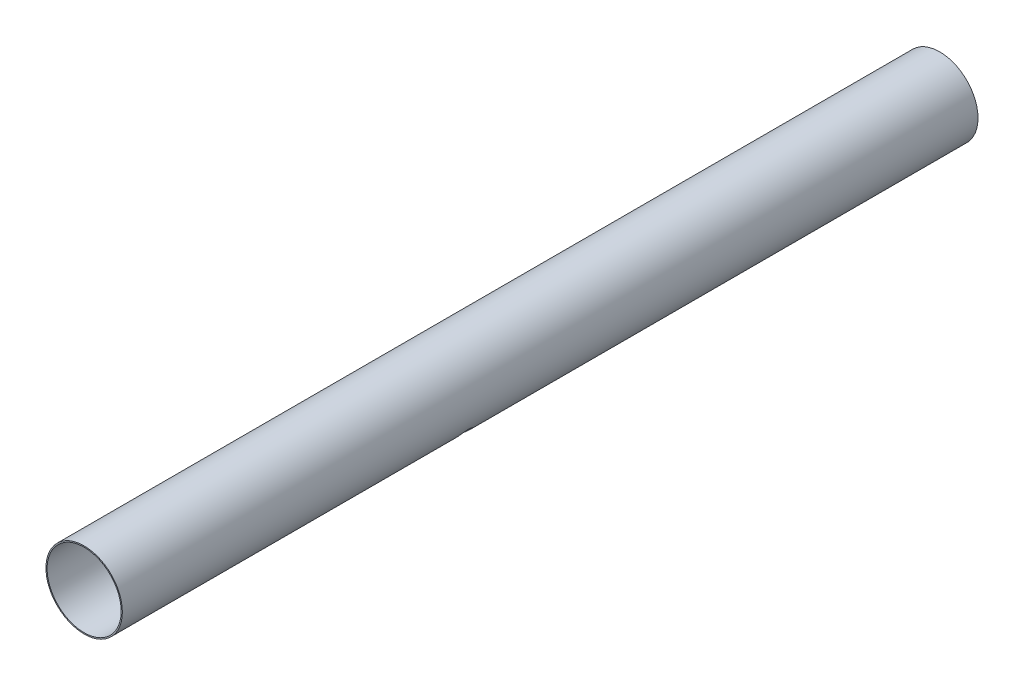
ISO-10303-21;
HEADER;
FILE_DESCRIPTION(('STEP AP214'),'2;1');
FILE_NAME('part.step','',(''),(''),'','','');
FILE_SCHEMA(('AUTOMOTIVE_DESIGN { 1 0 10303 214 1 1 1 1 }'));
ENDSEC;
DATA;
#1=APPLICATION_CONTEXT('core data for automotive mechanical design processes');
#2=APPLICATION_PROTOCOL_DEFINITION('international standard','automotive_design',2000,#1);
#3=PRODUCT_CONTEXT('',#1,'mechanical');
#4=PRODUCT('Part','Part','',(#3));
#5=PRODUCT_RELATED_PRODUCT_CATEGORY('part','',(#4));
#6=PRODUCT_DEFINITION_FORMATION('','',#4);
#7=PRODUCT_DEFINITION_CONTEXT('part definition',#1,'design');
#8=PRODUCT_DEFINITION('design','',#6,#7);
#9=PRODUCT_DEFINITION_SHAPE('','',#8);
#10=(LENGTH_UNIT() NAMED_UNIT(*) SI_UNIT(.MILLI.,.METRE.));
#11=(NAMED_UNIT(*) PLANE_ANGLE_UNIT() SI_UNIT($,.RADIAN.));
#12=(NAMED_UNIT(*) SI_UNIT($,.STERADIAN.) SOLID_ANGLE_UNIT());
#13=UNCERTAINTY_MEASURE_WITH_UNIT(LENGTH_MEASURE(1.E-05),#10,'distance_accuracy_value','');
#14=(GEOMETRIC_REPRESENTATION_CONTEXT(3) GLOBAL_UNCERTAINTY_ASSIGNED_CONTEXT((#13)) GLOBAL_UNIT_ASSIGNED_CONTEXT((#10,
#11,#12)) REPRESENTATION_CONTEXT('',''));
#15=CARTESIAN_POINT('',(0.,0.,0.));
#16=DIRECTION('',(0.,0.,1.));
#17=DIRECTION('',(1.,0.,0.));
#18=AXIS2_PLACEMENT_3D('',#15,#16,#17);
#19=CARTESIAN_POINT('',(0.,0.,1760.));
#20=DIRECTION('',(0.,0.,-1.));
#21=DIRECTION('',(-1.,0.,0.));
#22=AXIS2_PLACEMENT_3D('',#19,#20,#21);
#23=CYLINDRICAL_SURFACE('',#22,78.6);
#24=CARTESIAN_POINT('',(0.,0.,1760.));
#25=DIRECTION('',(0.,0.,1.));
#26=DIRECTION('',(1.,0.,0.));
#27=AXIS2_PLACEMENT_3D('',#24,#25,#26);
#28=CIRCLE('',#27,78.6);
#29=CARTESIAN_POINT('',(78.6,0.,1760.));
#30=VERTEX_POINT('',#29);
#31=EDGE_CURVE('E10',#30,#30,#28,.T.);
#32=ORIENTED_EDGE('',*,*,#31,.F.);
#33=EDGE_LOOP('',(#32));
#34=FACE_BOUND('',#33,.T.);
#35=CARTESIAN_POINT('',(0.,0.,0.));
#36=DIRECTION('',(0.,0.,1.));
#37=DIRECTION('',(1.,0.,0.));
#38=AXIS2_PLACEMENT_3D('',#35,#36,#37);
#39=CIRCLE('',#38,78.6);
#40=CARTESIAN_POINT('',(78.6,0.,0.));
#41=VERTEX_POINT('',#40);
#42=EDGE_CURVE('E45',#41,#41,#39,.T.);
#43=ORIENTED_EDGE('',*,*,#42,.T.);
#44=EDGE_LOOP('',(#43));
#45=FACE_BOUND('',#44,.T.);
#46=CARTESIAN_POINT('',(43.9505243062146,-65.1637277418107,1034.89));
#47=CARTESIAN_POINT('',(43.9505159620552,-65.1637303721092,1034.47271713877));
#48=CARTESIAN_POINT('',(43.9652384217338,-65.1538100614205,1034.0555334168));
#49=CARTESIAN_POINT('',(44.023943721418,-65.1141592396774,1033.22405097841));
#50=CARTESIAN_POINT('',(44.0679317584668,-65.0844252100595,1032.80975278762));
#51=CARTESIAN_POINT('',(44.1847242353224,-65.0051927845604,1031.98684421546));
#52=CARTESIAN_POINT('',(44.2575505430732,-64.9556793898151,1031.57823839457));
#53=CARTESIAN_POINT('',(44.4311914773969,-64.8370285672558,1030.76993867007));
#54=CARTESIAN_POINT('',(44.5320049126211,-64.767891974754,1030.37024438789));
#55=CARTESIAN_POINT('',(44.7604031320895,-64.6102586753202,1029.58292397466));
#56=CARTESIAN_POINT('',(44.8879624595007,-64.521780374507,1029.19528676766));
#57=CARTESIAN_POINT('',(45.1685479784072,-64.3256679034896,1028.43433995646));
#58=CARTESIAN_POINT('',(45.3215744167648,-64.2180335475979,1028.06103049119));
#59=CARTESIAN_POINT('',(45.6514944374181,-63.9839194147253,1027.33129791009));
#60=CARTESIAN_POINT('',(45.8283857520416,-63.8574414281721,1026.97487319419));
#61=CARTESIAN_POINT('',(46.2042780638948,-63.5859922627958,1026.28124444031));
#62=CARTESIAN_POINT('',(46.4032792192955,-63.4410209516726,1025.94404053985));
#63=CARTESIAN_POINT('',(46.8238861055079,-63.1312337250926,1025.28730638127));
#64=CARTESIAN_POINT('',(47.0457265130466,-62.9662078147052,1024.96802543716));
#65=CARTESIAN_POINT('',(47.5079383403382,-62.6182038883205,1024.35356858933));
#66=CARTESIAN_POINT('',(47.7483099044749,-62.4352257324468,1024.05839287346));
#67=CARTESIAN_POINT('',(48.2453637225954,-62.0519407704507,1023.49413691808));
#68=CARTESIAN_POINT('',(48.5020470395295,-61.8516328347305,1023.22505838208));
#69=CARTESIAN_POINT('',(49.0293826987146,-61.4344580807282,1022.71487631131));
#70=CARTESIAN_POINT('',(49.3000350719923,-61.2175912256665,1022.47377283867));
#71=CARTESIAN_POINT('',(49.8551026647136,-60.7664186606928,1022.01944584749));
#72=CARTESIAN_POINT('',(50.1396099715229,-60.531988345698,1021.80645847145));
#73=CARTESIAN_POINT('',(50.7178663007605,-60.0483146891936,1021.41219645256));
#74=CARTESIAN_POINT('',(51.0116153872086,-59.7990712450597,1021.23092202944));
#75=CARTESIAN_POINT('',(51.6057853992038,-59.2870700813203,1020.901468806));
#76=CARTESIAN_POINT('',(51.9062058837896,-59.0243132534112,1020.7532878254));
#77=CARTESIAN_POINT('',(52.5111755444465,-58.486751994383,1020.49116027846));
#78=CARTESIAN_POINT('',(52.815724665699,-58.2119477231181,1020.37721325804));
#79=CARTESIAN_POINT('',(53.4227376038693,-57.65534343149,1020.18561964427));
#80=CARTESIAN_POINT('',(53.7251824502031,-57.3736672936267,1020.10755296146));
#81=CARTESIAN_POINT('',(54.3292223952149,-56.8020113489932,1019.98633911665));
#82=CARTESIAN_POINT('',(54.6308175000117,-56.5120316021843,1019.94319170257));
#83=CARTESIAN_POINT('',(55.2308150282704,-55.9257809798318,1019.8921652345));
#84=CARTESIAN_POINT('',(55.5292176967182,-55.6295105923124,1019.88428345461));
#85=CARTESIAN_POINT('',(56.120647708474,-55.0328025725701,1019.90384480843));
#86=CARTESIAN_POINT('',(56.4136750897873,-54.7323649698372,1019.93128769229));
#87=CARTESIAN_POINT('',(56.9885307500805,-54.1335146235594,1020.02069021901));
#88=CARTESIAN_POINT('',(57.2704550709959,-53.8351262908086,1020.08219674972));
#89=CARTESIAN_POINT('',(57.8252357664962,-53.2387825322118,1020.23892501881));
#90=CARTESIAN_POINT('',(58.0980922326312,-52.9408271020241,1020.33414641669));
#91=CARTESIAN_POINT('',(58.6330985460348,-52.3476770163058,1020.55757808964));
#92=CARTESIAN_POINT('',(58.8952481296284,-52.0524824289034,1020.68578917658));
#93=CARTESIAN_POINT('',(59.4073718111308,-51.4672263958081,1020.97423981583));
#94=CARTESIAN_POINT('',(59.6573458004926,-51.177164995893,1021.1344796536));
#95=CARTESIAN_POINT('',(60.1452481196693,-50.6028845960812,1021.4868393449));
#96=CARTESIAN_POINT('',(60.3830981107435,-50.3187092796868,1021.67913884218));
#97=CARTESIAN_POINT('',(60.8440579056799,-49.7603426950927,1022.09357664517));
#98=CARTESIAN_POINT('',(61.0671676757844,-49.4861514497589,1022.31571501922));
#99=CARTESIAN_POINT('',(61.4977077866526,-48.9500781766212,1022.78830019676));
#100=CARTESIAN_POINT('',(61.7051367386704,-48.6881972398346,1023.03874950267));
#101=CARTESIAN_POINT('',(62.1034844071734,-48.1790589924253,1023.56623316623));
#102=CARTESIAN_POINT('',(62.2944029404067,-47.9318018441242,1023.84326781889));
#103=CARTESIAN_POINT('',(62.6619479362179,-47.450326455986,1024.4266712114));
#104=CARTESIAN_POINT('',(62.8382989447747,-47.2163779863757,1024.73343626965));
#105=CARTESIAN_POINT('',(63.1726593203938,-46.7680802878327,1025.37039415483));
#106=CARTESIAN_POINT('',(63.3306684834208,-46.5537312769304,1025.70058724232));
#107=CARTESIAN_POINT('',(63.6278472616623,-46.1467287015571,1026.38215852019));
#108=CARTESIAN_POINT('',(63.7670164774598,-45.9540755970654,1026.73353715949));
#109=CARTESIAN_POINT('',(64.0260927400344,-45.5924220777656,1027.45506855271));
#110=CARTESIAN_POINT('',(64.1459998582128,-45.4234215752819,1027.82522123703));
#111=CARTESIAN_POINT('',(64.3664063776047,-45.110557922407,1028.58243596779));
#112=CARTESIAN_POINT('',(64.4668699059638,-44.9667412811652,1028.96952768363));
#113=CARTESIAN_POINT('',(64.6478291357391,-44.7061893689188,1029.75726223645));
#114=CARTESIAN_POINT('',(64.7283247768564,-44.5894541796949,1030.15790511436));
#115=CARTESIAN_POINT('',(64.8691123361014,-44.3843863227232,1030.9698293318));
#116=CARTESIAN_POINT('',(64.9294062019212,-44.296050916931,1031.38110964165));
#117=CARTESIAN_POINT('',(65.0296284272761,-44.1487867970569,1032.21134421769));
#118=CARTESIAN_POINT('',(65.0695570830811,-44.0898576551778,1032.63029837216));
#119=CARTESIAN_POINT('',(65.1284719283267,-44.0027824586977,1033.46620374427));
#120=CARTESIAN_POINT('',(65.1477753559115,-43.9741701575764,1033.88308410895));
#121=CARTESIAN_POINT('',(65.1664846829048,-43.9464396591296,1034.71826818169));
#122=CARTESIAN_POINT('',(65.1658907882281,-43.9473211565768,1035.13657187496));
#123=CARTESIAN_POINT('',(65.1448079505444,-43.9785669209015,1035.9715518404));
#124=CARTESIAN_POINT('',(65.1243199679931,-44.0089297644654,1036.38822819016));
#125=CARTESIAN_POINT('',(65.0635074898809,-44.0987860259559,1037.21696474973));
#126=CARTESIAN_POINT('',(65.0231830309994,-44.1582793900177,1037.62902496807));
#127=CARTESIAN_POINT('',(64.9232431717476,-44.3050820542461,1038.44205458946));
#128=CARTESIAN_POINT('',(64.8637971626902,-44.3921470058527,1038.84308899881));
#129=CARTESIAN_POINT('',(64.7256815512105,-44.5932844234763,1039.63493790712));
#130=CARTESIAN_POINT('',(64.6470120932625,-44.7073566865189,1040.02575248286));
#131=CARTESIAN_POINT('',(64.4706570232871,-44.9612973789185,1040.79451951331));
#132=CARTESIAN_POINT('',(64.3729703068437,-45.1011673064346,1041.17247121951));
#133=CARTESIAN_POINT('',(64.1588486004493,-45.4052497499538,1041.91295650901));
#134=CARTESIAN_POINT('',(64.0424133804261,-45.5694625646783,1042.27548990303));
#135=CARTESIAN_POINT('',(63.7896163930167,-45.9226801042207,1042.98696232006));
#136=CARTESIAN_POINT('',(63.6530334256289,-46.1119572832868,1043.33568750251));
#137=CARTESIAN_POINT('',(63.3613989583273,-46.5118731610607,1044.01255797379));
#138=CARTESIAN_POINT('',(63.2063473333992,-46.7225120043642,1044.34070312328));
#139=CARTESIAN_POINT('',(62.8782402274934,-47.163146005187,1044.9742519029));
#140=CARTESIAN_POINT('',(62.7051832735549,-47.3931427460221,1045.27965366895));
#141=CARTESIAN_POINT('',(62.3416466793096,-47.8703356638075,1045.86564495831));
#142=CARTESIAN_POINT('',(62.1511669062523,-48.1175319718039,1046.14623429254));
#143=CARTESIAN_POINT('',(61.7506994087782,-48.6304268854172,1046.68442054399));
#144=CARTESIAN_POINT('',(61.5404773356028,-48.89633490467,1046.94164367382));
#145=CARTESIAN_POINT('',(61.1036683548078,-49.4411123261279,1047.42681306907));
#146=CARTESIAN_POINT('',(60.8770812752116,-49.719981864532,1047.65475902675));
#147=CARTESIAN_POINT('',(60.4085556439882,-50.2881891881918,1048.07971502209));
#148=CARTESIAN_POINT('',(60.1666174925243,-50.5775267004897,1048.27672586569));
#149=CARTESIAN_POINT('',(59.668570726746,-51.1641445284282,1048.63834961716));
#150=CARTESIAN_POINT('',(59.4124622445195,-51.4614247700178,1048.80296282697));
#151=CARTESIAN_POINT('',(58.8888662996428,-52.0597598709045,1049.09773556996));
#152=CARTESIAN_POINT('',(58.6214475468365,-52.3607857796624,1049.22807587968));
#153=CARTESIAN_POINT('',(58.075507290055,-52.9656626167252,1049.45444635702));
#154=CARTESIAN_POINT('',(57.796985808535,-53.2695135393155,1049.55047659403));
#155=CARTESIAN_POINT('',(57.2306180468551,-53.8775365897032,1049.70745475275));
#156=CARTESIAN_POINT('',(56.9427726216584,-54.18170868559,1049.76840588149));
#157=CARTESIAN_POINT('',(56.3596742904729,-54.7879913402614,1049.85474496104));
#158=CARTESIAN_POINT('',(56.0644214738202,-55.0901019238528,1049.88013334055));
#159=CARTESIAN_POINT('',(55.4733499941233,-55.6851912625596,1049.89502223923));
#160=CARTESIAN_POINT('',(55.1776146642486,-55.9782388515381,1049.8850858753));
#161=CARTESIAN_POINT('',(54.5831642620783,-56.5580282337268,1049.83065084087));
#162=CARTESIAN_POINT('',(54.2844492235289,-56.8447700982332,1049.78615256136));
#163=CARTESIAN_POINT('',(53.686299344519,-57.41002172112,1049.66294584436));
#164=CARTESIAN_POINT('',(53.3868645150071,-57.6885316038682,1049.58423792398));
#165=CARTESIAN_POINT('',(52.789602409827,-58.2355723234857,1049.39322406219));
#166=CARTESIAN_POINT('',(52.4917751400124,-58.5041031240396,1049.28091799852));
#167=CARTESIAN_POINT('',(51.9006744607119,-59.0291111894653,1049.02381078195));
#168=CARTESIAN_POINT('',(51.6073934352617,-59.2856105117969,1048.87907214866));
#169=CARTESIAN_POINT('',(51.0271862110578,-59.7857255049948,1048.55805206932));
#170=CARTESIAN_POINT('',(50.7402599933206,-60.0293412143509,1048.38177071751));
#171=CARTESIAN_POINT('',(50.1751186770055,-60.5025066435512,1047.99892604607));
#172=CARTESIAN_POINT('',(49.8969040288809,-60.7320556366262,1047.79236116367));
#173=CARTESIAN_POINT('',(49.3515401933253,-61.1760504083489,1047.35040412403));
#174=CARTESIAN_POINT('',(49.0843911374282,-61.3904960074873,1047.11501162424));
#175=CARTESIAN_POINT('',(48.5595940368193,-61.8064689875629,1046.61332127152));
#176=CARTESIAN_POINT('',(48.3021450790836,-62.0077582557537,1046.34661764068));
#177=CARTESIAN_POINT('',(47.8033265199174,-62.3931192682231,1045.78701745007));
#178=CARTESIAN_POINT('',(47.5619571147434,-62.5771908023642,1045.4941205707));
#179=CARTESIAN_POINT('',(47.0974797123052,-62.9275143668693,1044.88405193217));
#180=CARTESIAN_POINT('',(46.8743760265516,-63.0937621929067,1044.56687447573));
#181=CARTESIAN_POINT('',(46.4486238819879,-63.4078492121361,1043.91044804869));
#182=CARTESIAN_POINT('',(46.2459752605466,-63.5556885516898,1043.5711992536));
#183=CARTESIAN_POINT('',(45.8612726598169,-63.8338513888835,1042.86953155945));
#184=CARTESIAN_POINT('',(45.6794369285081,-63.9639915607438,1042.50692022777));
#185=CARTESIAN_POINT('',(45.3405416372599,-64.2046610104861,1041.76404281193));
#186=CARTESIAN_POINT('',(45.183482024728,-64.3151903299964,1041.38377676526));
#187=CARTESIAN_POINT('',(44.8959439520747,-64.5162383496425,1040.60855894281));
#188=CARTESIAN_POINT('',(44.7654437719233,-64.6067734060809,1040.21361948194));
#189=CARTESIAN_POINT('',(44.5323397371107,-64.767667116056,1039.41172364547));
#190=CARTESIAN_POINT('',(44.4297303082459,-64.8380298013663,1039.00476968913));
#191=CARTESIAN_POINT('',(44.2124060645775,-64.9865228025152,1037.98934139227));
#192=CARTESIAN_POINT('',(44.1143934288964,-65.0529509111443,1037.37546104263));
#193=CARTESIAN_POINT('',(43.9834597297827,-65.1415507731625,1036.13764643733));
#194=CARTESIAN_POINT('',(43.9505367782253,-65.163723810305,1035.51371247383));
#195=CARTESIAN_POINT('',(43.9505243062146,-65.1637277418107,1034.89));
#196=B_SPLINE_CURVE_WITH_KNOTS('',3,(#46,#47,#48,#49,#50,#51,#52,#53,#54,#55,#56,#57,#58,#59,
#60,#61,#62,#63,#64,#65,#66,#67,#68,#69,#70,#71,#72,#73,#74,#75,#76,#77,#78,#79,#80,#81,#82,#83,
#84,#85,#86,#87,#88,#89,#90,#91,#92,#93,#94,#95,#96,#97,#98,#99,#100,#101,#102,#103,#104,#105,
#106,#107,#108,#109,#110,#111,#112,#113,#114,#115,#116,#117,#118,#119,#120,#121,#122,#123,#124,
#125,#126,#127,#128,#129,#130,#131,#132,#133,#134,#135,#136,#137,#138,#139,#140,#141,#142,#143,
#144,#145,#146,#147,#148,#149,#150,#151,#152,#153,#154,#155,#156,#157,#158,#159,#160,#161,#162,
#163,#164,#165,#166,#167,#168,#169,#170,#171,#172,#173,#174,#175,#176,#177,#178,#179,#180,#181,
#182,#183,#184,#185,#186,#187,#188,#189,#190,#191,#192,#193,#194,#195),.UNSPECIFIED.,.T.,.F.,(4,
2,2,2,2,2,2,2,2,2,2,2,2,2,2,2,2,2,2,2,2,2,2,2,2,2,2,2,2,2,2,2,2,2,2,2,2,2,2,2,2,2,2,2,2,2,2,2,2,
2,2,2,2,2,2,2,2,2,2,2,2,2,2,2,2,2,2,2,2,2,2,2,2,2,4),(0.,1.25130069540162,2.50282365876023,
3.75529746985888,5.00771797415161,6.25895178799826,7.51019773122328,8.76132486302246,
10.0124609458092,11.2780574568276,12.5436638296248,13.8093527600115,15.0750445017504,
16.3507688950419,17.6265021274886,18.9021512869258,20.1777835252426,21.4380742468262,
22.6983558700173,23.9585400759614,25.2187153685307,26.4625170946593,27.7063062594074,
28.9501260361102,30.1939568995973,31.4450073738822,32.6960607131958,33.9472247205163,
35.1984026129414,36.4694707919436,37.7405531089857,39.0116623694402,40.2827669180139,
41.5561947170215,42.8296263614814,44.1029351965979,45.3762255072913,46.6296361525276,
47.8830338263854,49.1363709911549,50.3897058384068,51.6322302223008,52.8747452682591,
54.1173324940688,55.3599349694361,56.6173651649503,57.8748038724964,59.1323455282538,
60.3898967664538,61.6649271556453,62.9399709458267,64.214981512504,65.4899801962423,
66.7581123498416,68.0262419387697,69.2942555733156,70.5622539224432,71.8101301933192,
73.0579923476787,74.3058356398196,75.5536834725881,76.799146237407,78.0446052812051,
79.2901286185749,80.535666756931,81.7996356887358,83.0636200448921,84.327901901696,
85.5921737058333,86.8686786683946,88.1451809212684,89.4206350315357,90.6958340437248,
92.5662067935237,94.4365252866626),.UNSPECIFIED.);
#197=CARTESIAN_POINT('',(43.9505243062146,-65.1637277418107,1034.89));
#198=VERTEX_POINT('',#197);
#199=EDGE_CURVE('E55',#198,#198,#196,.T.);
#200=ORIENTED_EDGE('',*,*,#199,.F.);
#201=EDGE_LOOP('',(#200));
#202=FACE_BOUND('',#201,.T.);
#203=ADVANCED_FACE('F32',(#34,#45,#202),#23,.T.);
#204=CARTESIAN_POINT('',(0.,0.,1760.));
#205=DIRECTION('',(0.,0.,-1.));
#206=DIRECTION('',(-1.,0.,0.));
#207=AXIS2_PLACEMENT_3D('',#204,#205,#206);
#208=CYLINDRICAL_SURFACE('',#207,76.2);
#209=CARTESIAN_POINT('',(0.,0.,0.));
#210=DIRECTION('',(0.,0.,1.));
#211=DIRECTION('',(1.,0.,0.));
#212=AXIS2_PLACEMENT_3D('',#209,#210,#211);
#213=CIRCLE('',#212,76.2);
#214=CARTESIAN_POINT('',(76.2,0.,0.));
#215=VERTEX_POINT('',#214);
#216=EDGE_CURVE('E52',#215,#215,#213,.T.);
#217=ORIENTED_EDGE('',*,*,#216,.F.);
#218=EDGE_LOOP('',(#217));
#219=FACE_BOUND('',#218,.T.);
#220=CARTESIAN_POINT('',(0.,0.,1760.));
#221=DIRECTION('',(0.,0.,1.));
#222=DIRECTION('',(1.,0.,0.));
#223=AXIS2_PLACEMENT_3D('',#220,#221,#222);
#224=CIRCLE('',#223,76.2);
#225=CARTESIAN_POINT('',(76.2,0.,1760.));
#226=VERTEX_POINT('',#225);
#227=EDGE_CURVE('E50',#226,#226,#224,.T.);
#228=ORIENTED_EDGE('',*,*,#227,.T.);
#229=EDGE_LOOP('',(#228));
#230=FACE_BOUND('',#229,.T.);
#231=CARTESIAN_POINT('',(42.2206639695343,-63.4338674051304,1034.89));
#232=CARTESIAN_POINT('',(42.220655133744,-63.4338700710789,1034.47298396823));
#233=CARTESIAN_POINT('',(42.2354375400337,-63.4240409151695,1034.0560702946));
#234=CARTESIAN_POINT('',(42.2943782569194,-63.384753107115,1033.22512997744));
#235=CARTESIAN_POINT('',(42.338541621746,-63.3552910776426,1032.81110384302));
#236=CARTESIAN_POINT('',(42.4557907908649,-63.2767790730241,1031.98875051305));
#237=CARTESIAN_POINT('',(42.5288979119229,-63.2277146606898,1031.58042774795));
#238=CARTESIAN_POINT('',(42.7031928756535,-63.1101288383243,1030.77269221975));
#239=CARTESIAN_POINT('',(42.8043795665676,-63.0416082263384,1030.37327909192));
#240=CARTESIAN_POINT('',(43.0335955842406,-62.8853627610896,1029.58652709342));
#241=CARTESIAN_POINT('',(43.161598523514,-62.7976567827217,1029.19917678004));
#242=CARTESIAN_POINT('',(43.4431258837929,-62.603227226676,1028.43878879139));
#243=CARTESIAN_POINT('',(43.5966505421765,-62.4965034721126,1028.06575124929));
#244=CARTESIAN_POINT('',(43.9276039820411,-62.2643272003438,1027.33653341136));
#245=CARTESIAN_POINT('',(44.1050307235584,-62.1388762813411,1026.98035168044));
#246=CARTESIAN_POINT('',(44.4820112709666,-61.8695750059058,1026.28717176822));
#247=CARTESIAN_POINT('',(44.6815652502133,-61.7257245053201,1025.95017373724));
#248=CARTESIAN_POINT('',(45.1034392235677,-61.418146561159,1025.29356353835));
#249=CARTESIAN_POINT('',(45.3260089697463,-61.2541964669641,1024.97421608683));
#250=CARTESIAN_POINT('',(45.7896893928306,-60.9083571732621,1024.35960117202));
#251=CARTESIAN_POINT('',(46.0308002220734,-60.7264678263591,1024.06433390662));
#252=CARTESIAN_POINT('',(46.5293240793679,-60.3453430530656,1023.49986396426));
#253=CARTESIAN_POINT('',(46.7867382028561,-60.1461064607568,1023.23066304182));
#254=CARTESIAN_POINT('',(47.3155088792477,-59.7310268637411,1022.72020311753));
#255=CARTESIAN_POINT('',(47.5868654656309,-59.515183819157,1022.47894418279));
#256=CARTESIAN_POINT('',(48.1434504242458,-59.0658712791505,1022.02415190559));
#257=CARTESIAN_POINT('',(48.4287766897531,-58.8322681733289,1021.81087024977));
#258=CARTESIAN_POINT('',(49.0086189776314,-58.3501277979006,1021.41602293576));
#259=CARTESIAN_POINT('',(49.3031350678643,-58.1015904179997,1021.23445751184));
#260=CARTESIAN_POINT('',(49.8987655397072,-57.5908592751978,1020.90443369292));
#261=CARTESIAN_POINT('',(50.1998794571661,-57.3286664711677,1020.7559729772));
#262=CARTESIAN_POINT('',(50.8061437333288,-56.7920734460023,1020.49330493958));
#263=CARTESIAN_POINT('',(51.1112940349011,-56.5176733975196,1020.3790971334));
#264=CARTESIAN_POINT('',(51.7191627177076,-55.9619122709981,1020.18708447499));
#265=CARTESIAN_POINT('',(52.0218623675056,-55.6806848984607,1020.1088332232));
#266=CARTESIAN_POINT('',(52.626290223047,-55.1097666728942,1019.98723035295));
#267=CARTESIAN_POINT('',(52.9280184362252,-54.8200758848102,1019.94387846677));
#268=CARTESIAN_POINT('',(53.5281503234551,-54.2342414667681,1019.8924275068));
#269=CARTESIAN_POINT('',(53.8265542679813,-53.9380983676746,1019.88432554375));
#270=CARTESIAN_POINT('',(54.4178510094423,-53.3414836884508,1019.90343282485));
#271=CARTESIAN_POINT('',(54.7107438479163,-53.0410121409757,1019.93064180274));
#272=CARTESIAN_POINT('',(55.2849568272785,-52.442189677018,1020.01952898987));
#273=CARTESIAN_POINT('',(55.5663809638181,-52.1438668434683,1020.0807256247));
#274=CARTESIAN_POINT('',(56.1200485331912,-51.5475092020332,1020.23676327809));
#275=CARTESIAN_POINT('',(56.3922920646458,-51.2494743910872,1020.33160393511));
#276=CARTESIAN_POINT('',(56.9259728006462,-50.6560252053536,1020.55420297249));
#277=CARTESIAN_POINT('',(57.1874097282647,-50.3606108978705,1020.6819621958));
#278=CARTESIAN_POINT('',(57.698025301564,-49.774781536612,1020.96943809291));
#279=CARTESIAN_POINT('',(57.9472038317375,-49.4843665299602,1021.12915506776));
#280=CARTESIAN_POINT('',(58.4335256665877,-48.909158698675,1021.48045208108));
#281=CARTESIAN_POINT('',(58.6705859480002,-48.6244111803175,1021.6722212085));
#282=CARTESIAN_POINT('',(59.1299186937929,-48.0647873174453,1022.08555028497));
#283=CARTESIAN_POINT('',(59.3521911227263,-47.7899109965929,1022.30711030543));
#284=CARTESIAN_POINT('',(59.7810362908824,-47.2523644716936,1022.77849727066));
#285=CARTESIAN_POINT('',(59.987607555197,-46.9896954152494,1023.02832686549));
#286=CARTESIAN_POINT('',(60.3842462316849,-46.4788919064326,1023.55453695886));
#287=CARTESIAN_POINT('',(60.5743134492207,-46.2307576254845,1023.83091777045));
#288=CARTESIAN_POINT('',(60.9403603471968,-45.747196682399,1024.41327135698));
#289=CARTESIAN_POINT('',(61.1160475384402,-45.5120557769189,1024.7196654221));
#290=CARTESIAN_POINT('',(61.4491081841066,-45.0613542434082,1025.35591620378));
#291=CARTESIAN_POINT('',(61.6064814221369,-44.8457938467423,1025.68577319751));
#292=CARTESIAN_POINT('',(61.9024426927744,-44.4363749462168,1026.3667168232));
#293=CARTESIAN_POINT('',(62.0410302839621,-44.2425169523325,1026.71780395376));
#294=CARTESIAN_POINT('',(62.2990212098391,-43.8784884579615,1027.43880491626));
#295=CARTESIAN_POINT('',(62.4184246184148,-43.7083178662451,1027.80871867569));
#296=CARTESIAN_POINT('',(62.6379455119637,-43.3931418807856,1028.5655963502));
#297=CARTESIAN_POINT('',(62.7380231161858,-43.2481885852704,1028.95259354004));
#298=CARTESIAN_POINT('',(62.9183193202124,-42.9854684490392,1029.74020943619));
#299=CARTESIAN_POINT('',(62.9985378549473,-42.8677016974021,1030.14082818714));
#300=CARTESIAN_POINT('',(63.1388936348137,-42.6607051459524,1030.95277102565));
#301=CARTESIAN_POINT('',(63.1990329506538,-42.5714724035545,1031.36409400459));
#302=CARTESIAN_POINT('',(63.2990794791076,-42.4225718096384,1032.19447844721));
#303=CARTESIAN_POINT('',(63.3389870064631,-42.3629034981924,1032.61353979039));
#304=CARTESIAN_POINT('',(63.3979696309242,-42.2745812417168,1033.44929967184));
#305=CARTESIAN_POINT('',(63.4173794444623,-42.2454290566654,1033.86592201827));
#306=CARTESIAN_POINT('',(63.4364793662329,-42.2167429781693,1034.70063406099));
#307=CARTESIAN_POINT('',(63.4361696913857,-42.2172087589182,1035.11872374107));
#308=CARTESIAN_POINT('',(63.4158323048546,-42.2477519617633,1035.95331571353));
#309=CARTESIAN_POINT('',(63.3958056079889,-42.2778278598522,1036.36981808651));
#310=CARTESIAN_POINT('',(63.3360882991893,-42.3672373637436,1037.19824549261));
#311=CARTESIAN_POINT('',(63.2963977272478,-42.4265709100419,1037.61017053505));
#312=CARTESIAN_POINT('',(63.1979156056028,-42.5731272979352,1038.42270661585));
#313=CARTESIAN_POINT('',(63.1393044520312,-42.6600866249315,1038.82338712216));
#314=CARTESIAN_POINT('',(63.0030331190981,-42.861084275002,1039.61458083433));
#315=CARTESIAN_POINT('',(62.9253730931524,-42.9751223799889,1040.00509412205));
#316=CARTESIAN_POINT('',(62.7511955905434,-43.22905433953,1040.77332105079));
#317=CARTESIAN_POINT('',(62.6546769601815,-43.3689497759107,1041.15103390708));
#318=CARTESIAN_POINT('',(62.4430308452137,-43.6731291390485,1041.89111353882));
#319=CARTESIAN_POINT('',(62.3279031185629,-43.8374133830241,1042.25348011459));
#320=CARTESIAN_POINT('',(62.0777647146755,-44.1909332892738,1042.96495503044));
#321=CARTESIAN_POINT('',(61.9425209419233,-44.3804582968549,1043.31383766806));
#322=CARTESIAN_POINT('',(61.6536311393851,-44.7809189395688,1043.9910914528));
#323=CARTESIAN_POINT('',(61.4999849780283,-44.9918547277798,1044.31946245324));
#324=CARTESIAN_POINT('',(61.1747250664081,-45.4331170210965,1044.95354116178));
#325=CARTESIAN_POINT('',(61.0031097486126,-45.663445217547,1045.25924688872));
#326=CARTESIAN_POINT('',(60.6424618605117,-46.1413199522961,1045.84592920732));
#327=CARTESIAN_POINT('',(60.4534291479668,-46.3888666312057,1046.12690559699));
#328=CARTESIAN_POINT('',(60.0556591386034,-46.9027174611412,1046.66621611537));
#329=CARTESIAN_POINT('',(59.846670810889,-47.1692456550194,1046.92415181659));
#330=CARTESIAN_POINT('',(59.4122366016436,-47.7152789144254,1047.41078109941));
#331=CARTESIAN_POINT('',(59.1867905355751,-47.9947841254493,1047.63947435304));
#332=CARTESIAN_POINT('',(58.7204240765169,-48.5642586547127,1048.06595292828));
#333=CARTESIAN_POINT('',(58.4795041011247,-48.8542276904704,1048.2637390835));
#334=CARTESIAN_POINT('',(57.9833433983072,-49.4420853244401,1048.62693247608));
#335=CARTESIAN_POINT('',(57.728102812025,-49.739973844583,1048.7923400325));
#336=CARTESIAN_POINT('',(57.2061274796213,-50.3394082101804,1049.08866969382));
#337=CARTESIAN_POINT('',(56.9394654483112,-50.6409240655139,1049.21978050989));
#338=CARTESIAN_POINT('',(56.3948547617213,-51.2467192605059,1049.44770456854));
#339=CARTESIAN_POINT('',(56.1169061298527,-51.5509985944314,1049.54451788227));
#340=CARTESIAN_POINT('',(55.5514893641646,-52.1597985669911,1049.70306285302));
#341=CARTESIAN_POINT('',(55.2640221614645,-52.4643191791954,1049.76479793078));
#342=CARTESIAN_POINT('',(54.6814777895215,-53.0712058373988,1049.85269627599));
#343=CARTESIAN_POINT('',(54.3864007184516,-53.373571911129,1049.87886000212));
#344=CARTESIAN_POINT('',(53.7957774435932,-53.9687607380047,1049.89526243015));
#345=CARTESIAN_POINT('',(53.5003232160454,-54.2616584292,1049.88610002323));
#346=CARTESIAN_POINT('',(52.9062477233888,-54.8410530903184,1049.8332622443));
#347=CARTESIAN_POINT('',(52.6076264964214,-55.1275501371982,1049.78958728749));
#348=CARTESIAN_POINT('',(52.0094792859335,-55.6922187569466,1049.6680724107));
#349=CARTESIAN_POINT('',(51.709953317593,-55.9703904686552,1049.59023306081));
#350=CARTESIAN_POINT('',(51.1123283775334,-56.5166682848227,1049.40099837859));
#351=CARTESIAN_POINT('',(50.8142294111996,-56.784774351322,1049.28960291973));
#352=CARTESIAN_POINT('',(50.2224853249569,-57.3087937231981,1049.03438578606));
#353=CARTESIAN_POINT('',(49.9288319870376,-57.5647320740372,1048.89063455225));
#354=CARTESIAN_POINT('',(49.3477125454912,-58.0636714680043,1048.57164052525));
#355=CARTESIAN_POINT('',(49.0602464216213,-58.3066725534633,1048.3963978351));
#356=CARTESIAN_POINT('',(48.4938643483203,-58.7785761847724,1048.01567540064));
#357=CARTESIAN_POINT('',(48.2149488809436,-59.0074779364859,1047.81019395535));
#358=CARTESIAN_POINT('',(47.6680329762752,-59.4501676173977,1047.37044145976));
#359=CARTESIAN_POINT('',(47.4000326770305,-59.6639553554703,1047.13617004548));
#360=CARTESIAN_POINT('',(46.8731507934697,-60.0787976864118,1046.63654873991));
#361=CARTESIAN_POINT('',(46.6144779543997,-60.2796002025205,1046.3707693092));
#362=CARTESIAN_POINT('',(46.113110205111,-60.6639998518934,1045.81298788403));
#363=CARTESIAN_POINT('',(45.8704154971692,-60.8475967673539,1045.52098555771));
#364=CARTESIAN_POINT('',(45.4032067559235,-61.1970093438045,1044.91266487537));
#365=CARTESIAN_POINT('',(45.178697017739,-61.3628208070188,1044.59634080898));
#366=CARTESIAN_POINT('',(44.7500757591191,-61.6760991608103,1043.94156623035));
#367=CARTESIAN_POINT('',(44.5459640899049,-61.8235661851896,1043.60311587954));
#368=CARTESIAN_POINT('',(44.1581487977912,-62.1011705038696,1042.90272784805));
#369=CARTESIAN_POINT('',(43.9746797071688,-62.2311114436497,1042.54058236461));
#370=CARTESIAN_POINT('',(43.6325529604274,-62.4714658527435,1041.79852830313));
#371=CARTESIAN_POINT('',(43.4738952454128,-62.5818793684102,1041.41861976725));
#372=CARTESIAN_POINT('',(43.1832293697416,-62.7827996818708,1040.6439945721));
#373=CARTESIAN_POINT('',(43.0511998821279,-62.8733224157402,1040.24929006605));
#374=CARTESIAN_POINT('',(42.8151418384262,-63.0343078517372,1039.44774606979));
#375=CARTESIAN_POINT('',(42.7111078028023,-63.1047744795923,1039.04090897162));
#376=CARTESIAN_POINT('',(42.489203052565,-63.2545150909982,1038.01993730336));
#377=CARTESIAN_POINT('',(42.3887057121777,-63.3217499504377,1037.40013226763));
#378=CARTESIAN_POINT('',(42.25444392871,-63.4114233660305,1036.15014006962));
#379=CARTESIAN_POINT('',(42.2206773170661,-63.4338633778922,1035.51995324538));
#380=CARTESIAN_POINT('',(42.2206639695343,-63.4338674051304,1034.89));
#381=B_SPLINE_CURVE_WITH_KNOTS('',3,(#231,#232,#233,#234,#235,#236,#237,#238,#239,#240,#241,
#242,#243,#244,#245,#246,#247,#248,#249,#250,#251,#252,#253,#254,#255,#256,#257,#258,#259,#260,
#261,#262,#263,#264,#265,#266,#267,#268,#269,#270,#271,#272,#273,#274,#275,#276,#277,#278,#279,
#280,#281,#282,#283,#284,#285,#286,#287,#288,#289,#290,#291,#292,#293,#294,#295,#296,#297,#298,
#299,#300,#301,#302,#303,#304,#305,#306,#307,#308,#309,#310,#311,#312,#313,#314,#315,#316,#317,
#318,#319,#320,#321,#322,#323,#324,#325,#326,#327,#328,#329,#330,#331,#332,#333,#334,#335,#336,
#337,#338,#339,#340,#341,#342,#343,#344,#345,#346,#347,#348,#349,#350,#351,#352,#353,#354,#355,
#356,#357,#358,#359,#360,#361,#362,#363,#364,#365,#366,#367,#368,#369,#370,#371,#372,#373,#374,
#375,#376,#377,#378,#379,#380),.UNSPECIFIED.,.T.,.F.,(4,2,2,2,2,2,2,2,2,2,2,2,2,2,2,2,2,2,2,2,2,
2,2,2,2,2,2,2,2,2,2,2,2,2,2,2,2,2,2,2,2,2,2,2,2,2,2,2,2,2,2,2,2,2,2,2,2,2,2,2,2,2,2,2,2,2,2,2,2,
2,2,2,2,2,4),(0.,1.25049446849802,2.50120410772414,3.75283659984463,5.00441776049933,
6.25477308797302,7.50514004568119,8.75540035623752,10.0056704626553,11.2713133330889,
12.5369666033926,13.8027050047418,15.0684464456177,16.3448905213898,17.6213440252533,
18.897708018309,20.1740539649009,21.4340949492544,22.6941262670811,23.9540543042925,
25.2139728411599,26.4564788411659,27.6989714895146,28.9414959579529,30.1840321320873,
31.4341754981645,32.6843218607536,33.934585512602,35.1848639071974,36.4562796085484,
37.7277103310874,38.9991709241591,40.2706266201834,41.5446786937558,42.8187349418002,
44.0926597596934,45.3665647587815,46.6193297911021,47.8720810426365,49.1247678195107,
50.377452048676,51.6185289885674,52.8595959333981,54.1007388258406,55.3418978628998,
56.5987575045389,57.8556261328287,59.1126044950315,60.3695931232929,61.6452572922793,
62.9209357672373,64.1965798296551,65.4722113216098,66.7406687902841,68.0091236279975,
69.2774547482024,70.5457695141699,71.7926775987122,73.0395706832966,74.2864429621098,
75.5333199426722,76.777508191416,78.0216923688918,79.2659465603421,80.5102164833128,
81.7739875113305,83.0377745351119,84.3018591883742,85.5659346210185,86.8431673010828,
88.1203969492858,89.3965995464096,90.6725521710446,92.5616369778455,94.4506603936215),.UNSPECIFIED.);
#382=CARTESIAN_POINT('',(42.2206639695343,-63.4338674051304,1034.89));
#383=VERTEX_POINT('',#382);
#384=EDGE_CURVE('E36',#383,#383,#381,.T.);
#385=ORIENTED_EDGE('',*,*,#384,.T.);
#386=EDGE_LOOP('',(#385));
#387=FACE_BOUND('',#386,.T.);
#388=ADVANCED_FACE('F67',(#219,#230,#387),#208,.F.);
#389=CARTESIAN_POINT('',(0.,0.,1760.));
#390=DIRECTION('',(0.,0.,1.));
#391=DIRECTION('',(1.,0.,0.));
#392=AXIS2_PLACEMENT_3D('',#389,#390,#391);
#393=PLANE('',#392);
#394=ORIENTED_EDGE('',*,*,#31,.T.);
#395=EDGE_LOOP('',(#394));
#396=FACE_BOUND('',#395,.T.);
#397=ORIENTED_EDGE('',*,*,#227,.F.);
#398=EDGE_LOOP('',(#397));
#399=FACE_BOUND('',#398,.T.);
#400=ADVANCED_FACE('F72',(#396,#399),#393,.T.);
#401=CARTESIAN_POINT('',(0.,0.,0.));
#402=DIRECTION('',(0.,0.,1.));
#403=DIRECTION('',(1.,0.,0.));
#404=AXIS2_PLACEMENT_3D('',#401,#402,#403);
#405=PLANE('',#404);
#406=ORIENTED_EDGE('',*,*,#42,.F.);
#407=EDGE_LOOP('',(#406));
#408=FACE_BOUND('',#407,.T.);
#409=ORIENTED_EDGE('',*,*,#216,.T.);
#410=EDGE_LOOP('',(#409));
#411=FACE_BOUND('',#410,.T.);
#412=ADVANCED_FACE('F65',(#408,#411),#405,.F.);
#413=CARTESIAN_POINT('',(78.6000000000002,-78.5999999999999,1034.89));
#414=DIRECTION('',(-0.707106781186549,0.707106781186546,0.));
#415=DIRECTION('',(-0.707106781186546,-0.707106781186549,0.));
#416=AXIS2_PLACEMENT_3D('',#413,#414,#415);
#417=CYLINDRICAL_SURFACE('',#416,14.9999999999999);
#418=ORIENTED_EDGE('',*,*,#384,.F.);
#419=EDGE_LOOP('',(#418));
#420=FACE_BOUND('',#419,.T.);
#421=ORIENTED_EDGE('',*,*,#199,.T.);
#422=EDGE_LOOP('',(#421));
#423=FACE_BOUND('',#422,.T.);
#424=ADVANCED_FACE('F62',(#420,#423),#417,.F.);
#425=CLOSED_SHELL('',(#203,#388,#400,#412,#424));
#426=MANIFOLD_SOLID_BREP('B2',#425);
#427=ADVANCED_BREP_SHAPE_REPRESENTATION('',(#18,#426),#14);
#428=SHAPE_DEFINITION_REPRESENTATION(#9,#427);
ENDSEC;
END-ISO-10303-21;
